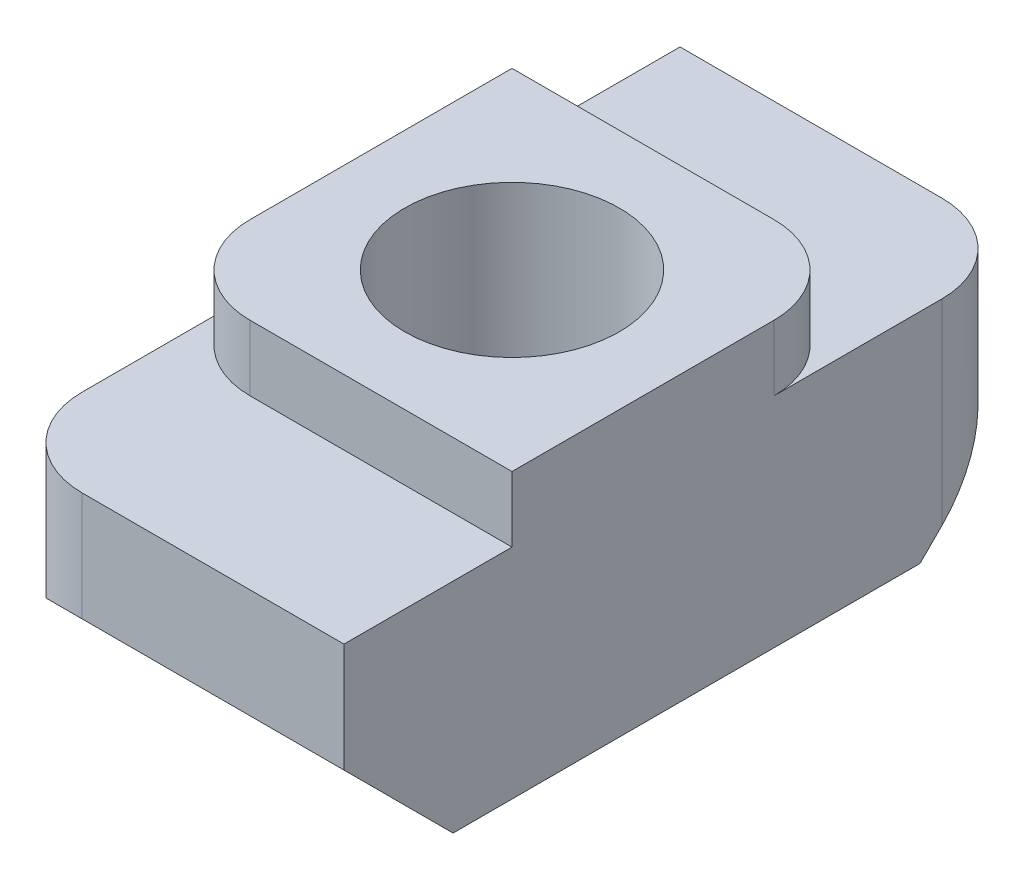
ISO-10303-21;
HEADER;
FILE_DESCRIPTION(('STEP AP214'),'2;1');
FILE_NAME('part.step','',(''),(''),'','','');
FILE_SCHEMA(('AUTOMOTIVE_DESIGN { 1 0 10303 214 1 1 1 1 }'));
ENDSEC;
DATA;
#1=APPLICATION_CONTEXT('core data for automotive mechanical design processes');
#2=APPLICATION_PROTOCOL_DEFINITION('international standard','automotive_design',2000,#1);
#3=PRODUCT_CONTEXT('',#1,'mechanical');
#4=PRODUCT('Part','Part','',(#3));
#5=PRODUCT_RELATED_PRODUCT_CATEGORY('part','',(#4));
#6=PRODUCT_DEFINITION_FORMATION('','',#4);
#7=PRODUCT_DEFINITION_CONTEXT('part definition',#1,'design');
#8=PRODUCT_DEFINITION('design','',#6,#7);
#9=PRODUCT_DEFINITION_SHAPE('','',#8);
#10=(LENGTH_UNIT() NAMED_UNIT(*) SI_UNIT(.MILLI.,.METRE.));
#11=(NAMED_UNIT(*) PLANE_ANGLE_UNIT() SI_UNIT($,.RADIAN.));
#12=(NAMED_UNIT(*) SI_UNIT($,.STERADIAN.) SOLID_ANGLE_UNIT());
#13=UNCERTAINTY_MEASURE_WITH_UNIT(LENGTH_MEASURE(1.E-05),#10,'distance_accuracy_value','');
#14=(GEOMETRIC_REPRESENTATION_CONTEXT(3) GLOBAL_UNCERTAINTY_ASSIGNED_CONTEXT((#13)) GLOBAL_UNIT_ASSIGNED_CONTEXT((#10,
#11,#12)) REPRESENTATION_CONTEXT('',''));
#15=CARTESIAN_POINT('',(0.,0.,0.));
#16=DIRECTION('',(0.,0.,1.));
#17=DIRECTION('',(1.,0.,0.));
#18=AXIS2_PLACEMENT_3D('',#15,#16,#17);
#19=CARTESIAN_POINT('',(4.,-1.5,4.));
#20=DIRECTION('',(0.,0.,-1.));
#21=DIRECTION('',(-1.,0.,0.));
#22=AXIS2_PLACEMENT_3D('',#19,#20,#21);
#23=PLANE('',#22);
#24=DIRECTION('',(-1.,0.,0.));
#25=VECTOR('',#24,1.);
#26=CARTESIAN_POINT('',(4.,0.,4.));
#27=LINE('',#26,#25);
#28=CARTESIAN_POINT('',(4.,0.,4.));
#29=VERTEX_POINT('',#28);
#30=CARTESIAN_POINT('',(-2.,0.,4.));
#31=VERTEX_POINT('',#30);
#32=EDGE_CURVE('E210',#29,#31,#27,.T.);
#33=ORIENTED_EDGE('',*,*,#32,.T.);
#34=DIRECTION('',(0.,-1.,0.));
#35=VECTOR('',#34,1.);
#36=CARTESIAN_POINT('',(-2.,-1.5,4.));
#37=LINE('',#36,#35);
#38=CARTESIAN_POINT('',(-2.,-1.5,4.));
#39=VERTEX_POINT('',#38);
#40=EDGE_CURVE('E163',#31,#39,#37,.T.);
#41=ORIENTED_EDGE('',*,*,#40,.T.);
#42=DIRECTION('',(-1.,0.,0.));
#43=VECTOR('',#42,1.);
#44=CARTESIAN_POINT('',(4.,-1.5,4.));
#45=LINE('',#44,#43);
#46=CARTESIAN_POINT('',(4.,-1.5,4.));
#47=VERTEX_POINT('',#46);
#48=EDGE_CURVE('E144',#47,#39,#45,.T.);
#49=ORIENTED_EDGE('',*,*,#48,.F.);
#50=DIRECTION('',(0.,-1.,0.));
#51=VECTOR('',#50,1.);
#52=CARTESIAN_POINT('',(4.,-1.5,4.));
#53=LINE('',#52,#51);
#54=EDGE_CURVE('E149',#29,#47,#53,.T.);
#55=ORIENTED_EDGE('',*,*,#54,.F.);
#56=EDGE_LOOP('',(#33,#41,#49,#55));
#57=FACE_BOUND('',#56,.T.);
#58=ADVANCED_FACE('F38',(#57),#23,.F.);
#59=CARTESIAN_POINT('',(4.,-1.5,7.85));
#60=DIRECTION('',(0.,-1.,0.));
#61=DIRECTION('',(0.,0.,-1.));
#62=AXIS2_PLACEMENT_3D('',#59,#60,#61);
#63=PLANE('',#62);
#64=DIRECTION('',(0.,0.,1.));
#65=VECTOR('',#64,1.);
#66=CARTESIAN_POINT('',(-4.,-1.5,7.85));
#67=LINE('',#66,#65);
#68=CARTESIAN_POINT('',(-4.,-1.5,2.));
#69=VERTEX_POINT('',#68);
#70=CARTESIAN_POINT('',(-4.,-1.5,5.85));
#71=VERTEX_POINT('',#70);
#72=EDGE_CURVE('E218',#69,#71,#67,.T.);
#73=ORIENTED_EDGE('',*,*,#72,.T.);
#74=CARTESIAN_POINT('',(-2.,-1.5,5.85));
#75=DIRECTION('',(0.,-1.,0.));
#76=DIRECTION('',(0.,0.,-1.));
#77=AXIS2_PLACEMENT_3D('',#74,#75,#76);
#78=CIRCLE('',#77,2.);
#79=CARTESIAN_POINT('',(-2.,-1.5,7.85));
#80=VERTEX_POINT('',#79);
#81=EDGE_CURVE('E53',#71,#80,#78,.F.);
#82=ORIENTED_EDGE('',*,*,#81,.T.);
#83=DIRECTION('',(-1.,0.,0.));
#84=VECTOR('',#83,1.);
#85=CARTESIAN_POINT('',(4.,-1.5,7.85));
#86=LINE('',#85,#84);
#87=CARTESIAN_POINT('',(4.,-1.5,7.85));
#88=VERTEX_POINT('',#87);
#89=EDGE_CURVE('E145',#88,#80,#86,.T.);
#90=ORIENTED_EDGE('',*,*,#89,.F.);
#91=DIRECTION('',(0.,0.,1.));
#92=VECTOR('',#91,1.);
#93=CARTESIAN_POINT('',(4.,-1.5,7.85));
#94=LINE('',#93,#92);
#95=EDGE_CURVE('E140',#47,#88,#94,.T.);
#96=ORIENTED_EDGE('',*,*,#95,.F.);
#97=ORIENTED_EDGE('',*,*,#48,.T.);
#98=CARTESIAN_POINT('',(-2.,-1.5,2.));
#99=DIRECTION('',(0.,-1.,0.));
#100=DIRECTION('',(0.,0.,-1.));
#101=AXIS2_PLACEMENT_3D('',#98,#99,#100);
#102=CIRCLE('',#101,2.);
#103=EDGE_CURVE('E11',#39,#69,#102,.T.);
#104=ORIENTED_EDGE('',*,*,#103,.T.);
#105=EDGE_LOOP('',(#73,#82,#90,#96,#97,#104));
#106=FACE_BOUND('',#105,.T.);
#107=ADVANCED_FACE('F142',(#106),#63,.F.);
#108=CARTESIAN_POINT('',(4.,-4.,7.85));
#109=DIRECTION('',(0.,0.,-1.));
#110=DIRECTION('',(-1.,0.,0.));
#111=AXIS2_PLACEMENT_3D('',#108,#109,#110);
#112=PLANE('',#111);
#113=ORIENTED_EDGE('',*,*,#89,.T.);
#114=DIRECTION('',(0.,-1.,0.));
#115=VECTOR('',#114,1.);
#116=CARTESIAN_POINT('',(-2.,-4.,7.85));
#117=LINE('',#116,#115);
#118=CARTESIAN_POINT('',(-2.,-4.,7.85));
#119=VERTEX_POINT('',#118);
#120=EDGE_CURVE('E191',#80,#119,#117,.T.);
#121=ORIENTED_EDGE('',*,*,#120,.T.);
#122=DIRECTION('',(-1.,0.,0.));
#123=VECTOR('',#122,1.);
#124=CARTESIAN_POINT('',(4.,-4.,7.85));
#125=LINE('',#124,#123);
#126=CARTESIAN_POINT('',(4.,-4.,7.85));
#127=VERTEX_POINT('',#126);
#128=EDGE_CURVE('E169',#127,#119,#125,.T.);
#129=ORIENTED_EDGE('',*,*,#128,.F.);
#130=DIRECTION('',(0.,-1.,0.));
#131=VECTOR('',#130,1.);
#132=CARTESIAN_POINT('',(4.,-4.,7.85));
#133=LINE('',#132,#131);
#134=EDGE_CURVE('E148',#88,#127,#133,.T.);
#135=ORIENTED_EDGE('',*,*,#134,.F.);
#136=EDGE_LOOP('',(#113,#121,#129,#135));
#137=FACE_BOUND('',#136,.T.);
#138=ADVANCED_FACE('F258',(#137),#112,.F.);
#139=CARTESIAN_POINT('',(4.,-6.5,5.35000000000001));
#140=DIRECTION('',(0.,0.707106781186546,-0.707106781186549));
#141=DIRECTION('',(0.,0.707106781186549,0.707106781186546));
#142=AXIS2_PLACEMENT_3D('',#139,#140,#141);
#143=PLANE('',#142);
#144=ORIENTED_EDGE('',*,*,#128,.T.);
#145=CARTESIAN_POINT('',(-2.,-6.00000000000001,5.85));
#146=DIRECTION('',(0.,0.707106781186546,-0.707106781186549));
#147=DIRECTION('',(0.,0.707106781186549,0.707106781186546));
#148=AXIS2_PLACEMENT_3D('',#145,#146,#147);
#149=ELLIPSE('',#148,2.82842712474619,2.);
#150=CARTESIAN_POINT('',(-4.,-6.00000000000001,5.85));
#151=VERTEX_POINT('',#150);
#152=EDGE_CURVE('E61',#119,#151,#149,.F.);
#153=ORIENTED_EDGE('',*,*,#152,.T.);
#154=DIRECTION('',(0.,-0.707106781186549,-0.707106781186546));
#155=VECTOR('',#154,1.);
#156=CARTESIAN_POINT('',(-4.,-6.5,5.35000000000001));
#157=LINE('',#156,#155);
#158=CARTESIAN_POINT('',(-4.,-6.5,5.35000000000001));
#159=VERTEX_POINT('',#158);
#160=EDGE_CURVE('E220',#151,#159,#157,.T.);
#161=ORIENTED_EDGE('',*,*,#160,.T.);
#162=DIRECTION('',(-1.,0.,0.));
#163=VECTOR('',#162,1.);
#164=CARTESIAN_POINT('',(4.,-6.5,5.35000000000001));
#165=LINE('',#164,#163);
#166=CARTESIAN_POINT('',(4.,-6.5,5.35000000000001));
#167=VERTEX_POINT('',#166);
#168=EDGE_CURVE('E247',#167,#159,#165,.T.);
#169=ORIENTED_EDGE('',*,*,#168,.F.);
#170=DIRECTION('',(0.,-0.707106781186549,-0.707106781186546));
#171=VECTOR('',#170,1.);
#172=CARTESIAN_POINT('',(4.,-6.5,5.35000000000001));
#173=LINE('',#172,#171);
#174=EDGE_CURVE('E256',#127,#167,#173,.T.);
#175=ORIENTED_EDGE('',*,*,#174,.F.);
#176=EDGE_LOOP('',(#144,#153,#161,#169,#175));
#177=FACE_BOUND('',#176,.T.);
#178=ADVANCED_FACE('F253',(#177),#143,.F.);
#179=CARTESIAN_POINT('',(4.,-6.5,-5.34999999999999));
#180=DIRECTION('',(0.,1.,0.));
#181=DIRECTION('',(0.,0.,1.));
#182=AXIS2_PLACEMENT_3D('',#179,#180,#181);
#183=PLANE('',#182);
#184=CARTESIAN_POINT('',(0.,-6.5,0.));
#185=DIRECTION('',(0.,1.,0.));
#186=DIRECTION('',(0.,0.,1.));
#187=AXIS2_PLACEMENT_3D('',#184,#185,#186);
#188=CIRCLE('',#187,2.4585);
#189=CARTESIAN_POINT('',(0.,-6.5,2.4585));
#190=VERTEX_POINT('',#189);
#191=EDGE_CURVE('E221',#190,#190,#188,.T.);
#192=ORIENTED_EDGE('',*,*,#191,.T.);
#193=EDGE_LOOP('',(#192));
#194=FACE_BOUND('',#193,.T.);
#195=DIRECTION('',(0.,0.,-1.));
#196=VECTOR('',#195,1.);
#197=CARTESIAN_POINT('',(-4.,-6.5,-5.34999999999999));
#198=LINE('',#197,#196);
#199=CARTESIAN_POINT('',(-4.,-6.5,-5.34999999999999));
#200=VERTEX_POINT('',#199);
#201=EDGE_CURVE('E223',#159,#200,#198,.T.);
#202=ORIENTED_EDGE('',*,*,#201,.T.);
#203=DIRECTION('',(-1.,0.,0.));
#204=VECTOR('',#203,1.);
#205=CARTESIAN_POINT('',(4.,-6.5,-5.34999999999999));
#206=LINE('',#205,#204);
#207=CARTESIAN_POINT('',(4.,-6.5,-5.34999999999999));
#208=VERTEX_POINT('',#207);
#209=EDGE_CURVE('E244',#208,#200,#206,.T.);
#210=ORIENTED_EDGE('',*,*,#209,.F.);
#211=DIRECTION('',(0.,0.,-1.));
#212=VECTOR('',#211,1.);
#213=CARTESIAN_POINT('',(4.,-6.5,-5.34999999999999));
#214=LINE('',#213,#212);
#215=EDGE_CURVE('E286',#167,#208,#214,.T.);
#216=ORIENTED_EDGE('',*,*,#215,.F.);
#217=ORIENTED_EDGE('',*,*,#168,.T.);
#218=EDGE_LOOP('',(#202,#210,#216,#217));
#219=FACE_BOUND('',#218,.T.);
#220=ADVANCED_FACE('F284',(#194,#219),#183,.F.);
#221=CARTESIAN_POINT('',(4.,-4.,-7.85));
#222=DIRECTION('',(0.,0.707106781186549,0.707106781186547));
#223=DIRECTION('',(0.,-0.707106781186546,0.707106781186549));
#224=AXIS2_PLACEMENT_3D('',#221,#222,#223);
#225=PLANE('',#224);
#226=DIRECTION('',(-1.,0.,0.));
#227=VECTOR('',#226,1.);
#228=CARTESIAN_POINT('',(4.,-4.,-7.85));
#229=LINE('',#228,#227);
#230=CARTESIAN_POINT('',(2.,-4.,-7.85));
#231=VERTEX_POINT('',#230);
#232=CARTESIAN_POINT('',(-4.,-4.,-7.85));
#233=VERTEX_POINT('',#232);
#234=EDGE_CURVE('E242',#231,#233,#229,.T.);
#235=ORIENTED_EDGE('',*,*,#234,.F.);
#236=CARTESIAN_POINT('',(2.,-5.99999999999999,-5.85));
#237=DIRECTION('',(0.,0.707106781186549,0.707106781186547));
#238=DIRECTION('',(0.,0.707106781186546,-0.707106781186549));
#239=AXIS2_PLACEMENT_3D('',#236,#237,#238);
#240=ELLIPSE('',#239,2.82842712474619,2.);
#241=CARTESIAN_POINT('',(4.,-5.99999999999999,-5.85));
#242=VERTEX_POINT('',#241);
#243=EDGE_CURVE('E189',#231,#242,#240,.F.);
#244=ORIENTED_EDGE('',*,*,#243,.T.);
#245=DIRECTION('',(0.,0.707106781186546,-0.707106781186548));
#246=VECTOR('',#245,1.);
#247=CARTESIAN_POINT('',(4.,-4.,-7.85));
#248=LINE('',#247,#246);
#249=EDGE_CURVE('E214',#208,#242,#248,.T.);
#250=ORIENTED_EDGE('',*,*,#249,.F.);
#251=ORIENTED_EDGE('',*,*,#209,.T.);
#252=DIRECTION('',(0.,0.707106781186546,-0.707106781186548));
#253=VECTOR('',#252,1.);
#254=CARTESIAN_POINT('',(-4.,-4.,-7.85));
#255=LINE('',#254,#253);
#256=EDGE_CURVE('E225',#200,#233,#255,.T.);
#257=ORIENTED_EDGE('',*,*,#256,.T.);
#258=EDGE_LOOP('',(#235,#244,#250,#251,#257));
#259=FACE_BOUND('',#258,.T.);
#260=ADVANCED_FACE('F280',(#259),#225,.F.);
#261=CARTESIAN_POINT('',(4.,-1.5,-7.85));
#262=DIRECTION('',(0.,0.,1.));
#263=DIRECTION('',(1.,0.,0.));
#264=AXIS2_PLACEMENT_3D('',#261,#262,#263);
#265=PLANE('',#264);
#266=DIRECTION('',(-1.,0.,0.));
#267=VECTOR('',#266,1.);
#268=CARTESIAN_POINT('',(4.,-1.5,-7.85));
#269=LINE('',#268,#267);
#270=CARTESIAN_POINT('',(2.,-1.5,-7.85));
#271=VERTEX_POINT('',#270);
#272=CARTESIAN_POINT('',(-4.,-1.5,-7.85));
#273=VERTEX_POINT('',#272);
#274=EDGE_CURVE('E240',#271,#273,#269,.T.);
#275=ORIENTED_EDGE('',*,*,#274,.F.);
#276=DIRECTION('',(0.,1.,0.));
#277=VECTOR('',#276,1.);
#278=CARTESIAN_POINT('',(2.,-1.5,-7.85));
#279=LINE('',#278,#277);
#280=EDGE_CURVE('E187',#271,#231,#279,.F.);
#281=ORIENTED_EDGE('',*,*,#280,.T.);
#282=ORIENTED_EDGE('',*,*,#234,.T.);
#283=DIRECTION('',(0.,1.,0.));
#284=VECTOR('',#283,1.);
#285=CARTESIAN_POINT('',(-4.,-1.5,-7.85));
#286=LINE('',#285,#284);
#287=EDGE_CURVE('E228',#233,#273,#286,.T.);
#288=ORIENTED_EDGE('',*,*,#287,.T.);
#289=EDGE_LOOP('',(#275,#281,#282,#288));
#290=FACE_BOUND('',#289,.T.);
#291=ADVANCED_FACE('F276',(#290),#265,.F.);
#292=CARTESIAN_POINT('',(4.,-1.5,-4.));
#293=DIRECTION('',(0.,-1.,0.));
#294=DIRECTION('',(0.,0.,-1.));
#295=AXIS2_PLACEMENT_3D('',#292,#293,#294);
#296=PLANE('',#295);
#297=DIRECTION('',(0.,0.,1.));
#298=VECTOR('',#297,1.);
#299=CARTESIAN_POINT('',(4.,-1.5,-4.));
#300=LINE('',#299,#298);
#301=CARTESIAN_POINT('',(4.,-1.5,-5.85));
#302=VERTEX_POINT('',#301);
#303=CARTESIAN_POINT('',(4.,-1.5,-2.));
#304=VERTEX_POINT('',#303);
#305=EDGE_CURVE('E201',#302,#304,#300,.T.);
#306=ORIENTED_EDGE('',*,*,#305,.F.);
#307=CARTESIAN_POINT('',(2.,-1.5,-5.85));
#308=DIRECTION('',(0.,-1.,0.));
#309=DIRECTION('',(0.,0.,-1.));
#310=AXIS2_PLACEMENT_3D('',#307,#308,#309);
#311=CIRCLE('',#310,2.);
#312=EDGE_CURVE('E185',#302,#271,#311,.F.);
#313=ORIENTED_EDGE('',*,*,#312,.T.);
#314=ORIENTED_EDGE('',*,*,#274,.T.);
#315=DIRECTION('',(0.,0.,1.));
#316=VECTOR('',#315,1.);
#317=CARTESIAN_POINT('',(-4.,-1.5,-4.));
#318=LINE('',#317,#316);
#319=CARTESIAN_POINT('',(-4.,-1.5,-4.));
#320=VERTEX_POINT('',#319);
#321=EDGE_CURVE('E231',#273,#320,#318,.T.);
#322=ORIENTED_EDGE('',*,*,#321,.T.);
#323=DIRECTION('',(-1.,0.,0.));
#324=VECTOR('',#323,1.);
#325=CARTESIAN_POINT('',(4.,-1.5,-4.));
#326=LINE('',#325,#324);
#327=CARTESIAN_POINT('',(2.,-1.5,-4.));
#328=VERTEX_POINT('',#327);
#329=EDGE_CURVE('E203',#328,#320,#326,.T.);
#330=ORIENTED_EDGE('',*,*,#329,.F.);
#331=CARTESIAN_POINT('',(2.,-1.5,-2.));
#332=DIRECTION('',(0.,-1.,0.));
#333=DIRECTION('',(0.,0.,-1.));
#334=AXIS2_PLACEMENT_3D('',#331,#332,#333);
#335=CIRCLE('',#334,2.);
#336=EDGE_CURVE('E46',#328,#304,#335,.T.);
#337=ORIENTED_EDGE('',*,*,#336,.T.);
#338=EDGE_LOOP('',(#306,#313,#314,#322,#330,#337));
#339=FACE_BOUND('',#338,.T.);
#340=ADVANCED_FACE('F200',(#339),#296,.F.);
#341=CARTESIAN_POINT('',(4.,0.,-4.));
#342=DIRECTION('',(0.,0.,1.));
#343=DIRECTION('',(1.,0.,0.));
#344=AXIS2_PLACEMENT_3D('',#341,#342,#343);
#345=PLANE('',#344);
#346=DIRECTION('',(-1.,0.,0.));
#347=VECTOR('',#346,1.);
#348=CARTESIAN_POINT('',(4.,0.,-4.));
#349=LINE('',#348,#347);
#350=CARTESIAN_POINT('',(2.,0.,-4.));
#351=VERTEX_POINT('',#350);
#352=CARTESIAN_POINT('',(-4.,0.,-4.));
#353=VERTEX_POINT('',#352);
#354=EDGE_CURVE('E212',#351,#353,#349,.T.);
#355=ORIENTED_EDGE('',*,*,#354,.F.);
#356=DIRECTION('',(0.,1.,0.));
#357=VECTOR('',#356,1.);
#358=CARTESIAN_POINT('',(2.,0.,-4.));
#359=LINE('',#358,#357);
#360=EDGE_CURVE('E178',#351,#328,#359,.F.);
#361=ORIENTED_EDGE('',*,*,#360,.T.);
#362=ORIENTED_EDGE('',*,*,#329,.T.);
#363=DIRECTION('',(0.,1.,0.));
#364=VECTOR('',#363,1.);
#365=CARTESIAN_POINT('',(-4.,0.,-4.));
#366=LINE('',#365,#364);
#367=EDGE_CURVE('E233',#320,#353,#366,.T.);
#368=ORIENTED_EDGE('',*,*,#367,.T.);
#369=EDGE_LOOP('',(#355,#361,#362,#368));
#370=FACE_BOUND('',#369,.T.);
#371=ADVANCED_FACE('F269',(#370),#345,.F.);
#372=CARTESIAN_POINT('',(4.,0.,4.));
#373=DIRECTION('',(0.,-1.,0.));
#374=DIRECTION('',(0.,0.,-1.));
#375=AXIS2_PLACEMENT_3D('',#372,#373,#374);
#376=PLANE('',#375);
#377=CARTESIAN_POINT('',(0.,0.,0.));
#378=DIRECTION('',(0.,1.,0.));
#379=DIRECTION('',(0.,0.,1.));
#380=AXIS2_PLACEMENT_3D('',#377,#378,#379);
#381=CIRCLE('',#380,2.4585);
#382=CARTESIAN_POINT('',(0.,0.,2.4585));
#383=VERTEX_POINT('',#382);
#384=EDGE_CURVE('E294',#383,#383,#381,.T.);
#385=ORIENTED_EDGE('',*,*,#384,.F.);
#386=EDGE_LOOP('',(#385));
#387=FACE_BOUND('',#386,.T.);
#388=DIRECTION('',(0.,0.,1.));
#389=VECTOR('',#388,1.);
#390=CARTESIAN_POINT('',(4.,0.,4.));
#391=LINE('',#390,#389);
#392=CARTESIAN_POINT('',(4.,0.,-2.));
#393=VERTEX_POINT('',#392);
#394=EDGE_CURVE('E155',#393,#29,#391,.T.);
#395=ORIENTED_EDGE('',*,*,#394,.F.);
#396=CARTESIAN_POINT('',(2.,0.,-2.));
#397=DIRECTION('',(0.,-1.,0.));
#398=DIRECTION('',(0.,0.,-1.));
#399=AXIS2_PLACEMENT_3D('',#396,#397,#398);
#400=CIRCLE('',#399,2.);
#401=EDGE_CURVE('E176',#393,#351,#400,.F.);
#402=ORIENTED_EDGE('',*,*,#401,.T.);
#403=ORIENTED_EDGE('',*,*,#354,.T.);
#404=DIRECTION('',(0.,0.,1.));
#405=VECTOR('',#404,1.);
#406=CARTESIAN_POINT('',(-4.,0.,4.));
#407=LINE('',#406,#405);
#408=CARTESIAN_POINT('',(-4.,0.,2.));
#409=VERTEX_POINT('',#408);
#410=EDGE_CURVE('E159',#353,#409,#407,.T.);
#411=ORIENTED_EDGE('',*,*,#410,.T.);
#412=CARTESIAN_POINT('',(-2.,0.,2.));
#413=DIRECTION('',(0.,-1.,0.));
#414=DIRECTION('',(0.,0.,-1.));
#415=AXIS2_PLACEMENT_3D('',#412,#413,#414);
#416=CIRCLE('',#415,2.);
#417=EDGE_CURVE('E174',#409,#31,#416,.F.);
#418=ORIENTED_EDGE('',*,*,#417,.T.);
#419=ORIENTED_EDGE('',*,*,#32,.F.);
#420=EDGE_LOOP('',(#395,#402,#403,#411,#418,#419));
#421=FACE_BOUND('',#420,.T.);
#422=ADVANCED_FACE('F208',(#387,#421),#376,.F.);
#423=CARTESIAN_POINT('',(4.,0.,0.));
#424=DIRECTION('',(-1.,0.,0.));
#425=DIRECTION('',(0.,0.,1.));
#426=AXIS2_PLACEMENT_3D('',#423,#424,#425);
#427=PLANE('',#426);
#428=ORIENTED_EDGE('',*,*,#305,.T.);
#429=DIRECTION('',(0.,1.,0.));
#430=VECTOR('',#429,1.);
#431=CARTESIAN_POINT('',(4.,0.,-2.));
#432=LINE('',#431,#430);
#433=EDGE_CURVE('E167',#304,#393,#432,.T.);
#434=ORIENTED_EDGE('',*,*,#433,.T.);
#435=ORIENTED_EDGE('',*,*,#394,.T.);
#436=ORIENTED_EDGE('',*,*,#54,.T.);
#437=ORIENTED_EDGE('',*,*,#95,.T.);
#438=ORIENTED_EDGE('',*,*,#134,.T.);
#439=ORIENTED_EDGE('',*,*,#174,.T.);
#440=ORIENTED_EDGE('',*,*,#215,.T.);
#441=ORIENTED_EDGE('',*,*,#249,.T.);
#442=DIRECTION('',(0.,1.,0.));
#443=VECTOR('',#442,1.);
#444=CARTESIAN_POINT('',(4.,0.,-5.85));
#445=LINE('',#444,#443);
#446=EDGE_CURVE('E164',#242,#302,#445,.T.);
#447=ORIENTED_EDGE('',*,*,#446,.T.);
#448=EDGE_LOOP('',(#428,#434,#435,#436,#437,#438,#439,#440,#441,#447));
#449=FACE_BOUND('',#448,.T.);
#450=ADVANCED_FACE('F152',(#449),#427,.F.);
#451=CARTESIAN_POINT('',(-4.,0.,0.));
#452=DIRECTION('',(-1.,0.,0.));
#453=DIRECTION('',(0.,0.,1.));
#454=AXIS2_PLACEMENT_3D('',#451,#452,#453);
#455=PLANE('',#454);
#456=ORIENTED_EDGE('',*,*,#72,.F.);
#457=DIRECTION('',(0.,-1.,0.));
#458=VECTOR('',#457,1.);
#459=CARTESIAN_POINT('',(-4.,0.,2.));
#460=LINE('',#459,#458);
#461=EDGE_CURVE('E183',#69,#409,#460,.F.);
#462=ORIENTED_EDGE('',*,*,#461,.T.);
#463=ORIENTED_EDGE('',*,*,#410,.F.);
#464=ORIENTED_EDGE('',*,*,#367,.F.);
#465=ORIENTED_EDGE('',*,*,#321,.F.);
#466=ORIENTED_EDGE('',*,*,#287,.F.);
#467=ORIENTED_EDGE('',*,*,#256,.F.);
#468=ORIENTED_EDGE('',*,*,#201,.F.);
#469=ORIENTED_EDGE('',*,*,#160,.F.);
#470=DIRECTION('',(0.,-1.,0.));
#471=VECTOR('',#470,1.);
#472=CARTESIAN_POINT('',(-4.,-1.5,5.85));
#473=LINE('',#472,#471);
#474=EDGE_CURVE('E181',#151,#71,#473,.F.);
#475=ORIENTED_EDGE('',*,*,#474,.T.);
#476=EDGE_LOOP('',(#456,#462,#463,#464,#465,#466,#467,#468,#469,#475));
#477=FACE_BOUND('',#476,.T.);
#478=ADVANCED_FACE('F260',(#477),#455,.T.);
#479=CARTESIAN_POINT('',(2.,0.,-2.));
#480=DIRECTION('',(0.,1.,0.));
#481=DIRECTION('',(0.,0.,1.));
#482=AXIS2_PLACEMENT_3D('',#479,#480,#481);
#483=CYLINDRICAL_SURFACE('',#482,2.);
#484=ORIENTED_EDGE('',*,*,#336,.F.);
#485=ORIENTED_EDGE('',*,*,#360,.F.);
#486=ORIENTED_EDGE('',*,*,#401,.F.);
#487=ORIENTED_EDGE('',*,*,#433,.F.);
#488=EDGE_LOOP('',(#484,#485,#486,#487));
#489=FACE_BOUND('',#488,.T.);
#490=ADVANCED_FACE('F206',(#489),#483,.T.);
#491=CARTESIAN_POINT('',(-2.,-1.5,2.));
#492=DIRECTION('',(0.,1.,0.));
#493=DIRECTION('',(0.,0.,1.));
#494=AXIS2_PLACEMENT_3D('',#491,#492,#493);
#495=CYLINDRICAL_SURFACE('',#494,2.);
#496=ORIENTED_EDGE('',*,*,#417,.F.);
#497=ORIENTED_EDGE('',*,*,#461,.F.);
#498=ORIENTED_EDGE('',*,*,#103,.F.);
#499=ORIENTED_EDGE('',*,*,#40,.F.);
#500=EDGE_LOOP('',(#496,#497,#498,#499));
#501=FACE_BOUND('',#500,.T.);
#502=ADVANCED_FACE('F265',(#501),#495,.T.);
#503=CARTESIAN_POINT('',(2.,0.,-5.85));
#504=DIRECTION('',(0.,1.,0.));
#505=DIRECTION('',(0.,0.,1.));
#506=AXIS2_PLACEMENT_3D('',#503,#504,#505);
#507=CYLINDRICAL_SURFACE('',#506,2.);
#508=ORIENTED_EDGE('',*,*,#243,.F.);
#509=ORIENTED_EDGE('',*,*,#280,.F.);
#510=ORIENTED_EDGE('',*,*,#312,.F.);
#511=ORIENTED_EDGE('',*,*,#446,.F.);
#512=EDGE_LOOP('',(#508,#509,#510,#511));
#513=FACE_BOUND('',#512,.T.);
#514=ADVANCED_FACE('F320',(#513),#507,.T.);
#515=CARTESIAN_POINT('',(-2.,-4.,5.85));
#516=DIRECTION('',(0.,1.,0.));
#517=DIRECTION('',(0.,0.,1.));
#518=AXIS2_PLACEMENT_3D('',#515,#516,#517);
#519=CYLINDRICAL_SURFACE('',#518,2.);
#520=ORIENTED_EDGE('',*,*,#81,.F.);
#521=ORIENTED_EDGE('',*,*,#474,.F.);
#522=ORIENTED_EDGE('',*,*,#152,.F.);
#523=ORIENTED_EDGE('',*,*,#120,.F.);
#524=EDGE_LOOP('',(#520,#521,#522,#523));
#525=FACE_BOUND('',#524,.T.);
#526=ADVANCED_FACE('F40',(#525),#519,.T.);
#527=CARTESIAN_POINT('',(0.,0.,0.));
#528=DIRECTION('',(0.,1.,0.));
#529=DIRECTION('',(0.,0.,1.));
#530=AXIS2_PLACEMENT_3D('',#527,#528,#529);
#531=CYLINDRICAL_SURFACE('',#530,2.4585);
#532=ORIENTED_EDGE('',*,*,#191,.F.);
#533=EDGE_LOOP('',(#532));
#534=FACE_BOUND('',#533,.T.);
#535=ORIENTED_EDGE('',*,*,#384,.T.);
#536=EDGE_LOOP('',(#535));
#537=FACE_BOUND('',#536,.T.);
#538=ADVANCED_FACE('F298',(#534,#537),#531,.F.);
#539=CLOSED_SHELL('',(#58,#107,#138,#178,#220,#260,#291,#340,#371,#422,#450,#478,#490,#502,#514,
#526,#538));
#540=MANIFOLD_SOLID_BREP('B2',#539);
#541=ADVANCED_BREP_SHAPE_REPRESENTATION('',(#18,#540),#14);
#542=SHAPE_DEFINITION_REPRESENTATION(#9,#541);
ENDSEC;
END-ISO-10303-21;
